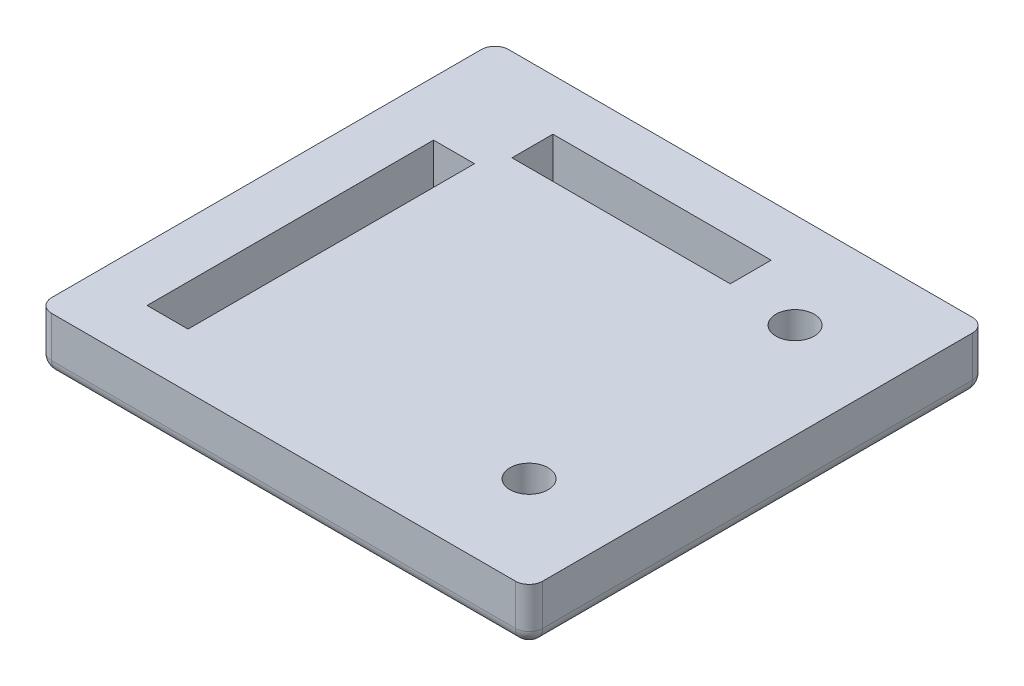
ISO-10303-21;
HEADER;
FILE_DESCRIPTION(('STEP AP214'),'2;1');
FILE_NAME('part.step','',(''),(''),'','','');
FILE_SCHEMA(('AUTOMOTIVE_DESIGN { 1 0 10303 214 1 1 1 1 }'));
ENDSEC;
DATA;
#1=APPLICATION_CONTEXT('core data for automotive mechanical design processes');
#2=APPLICATION_PROTOCOL_DEFINITION('international standard','automotive_design',2000,#1);
#3=PRODUCT_CONTEXT('',#1,'mechanical');
#4=PRODUCT('Part','Part','',(#3));
#5=PRODUCT_RELATED_PRODUCT_CATEGORY('part','',(#4));
#6=PRODUCT_DEFINITION_FORMATION('','',#4);
#7=PRODUCT_DEFINITION_CONTEXT('part definition',#1,'design');
#8=PRODUCT_DEFINITION('design','',#6,#7);
#9=PRODUCT_DEFINITION_SHAPE('','',#8);
#10=(LENGTH_UNIT() NAMED_UNIT(*) SI_UNIT(.MILLI.,.METRE.));
#11=(NAMED_UNIT(*) PLANE_ANGLE_UNIT() SI_UNIT($,.RADIAN.));
#12=(NAMED_UNIT(*) SI_UNIT($,.STERADIAN.) SOLID_ANGLE_UNIT());
#13=UNCERTAINTY_MEASURE_WITH_UNIT(LENGTH_MEASURE(1.E-05),#10,'distance_accuracy_value','');
#14=(GEOMETRIC_REPRESENTATION_CONTEXT(3) GLOBAL_UNCERTAINTY_ASSIGNED_CONTEXT((#13)) GLOBAL_UNIT_ASSIGNED_CONTEXT((#10,
#11,#12)) REPRESENTATION_CONTEXT('',''));
#15=CARTESIAN_POINT('',(0.,0.,0.));
#16=DIRECTION('',(0.,0.,1.));
#17=DIRECTION('',(1.,0.,0.));
#18=AXIS2_PLACEMENT_3D('',#15,#16,#17);
#19=CARTESIAN_POINT('',(0.,4.,0.));
#20=DIRECTION('',(0.,1.,0.));
#21=DIRECTION('',(0.,0.,1.));
#22=AXIS2_PLACEMENT_3D('',#19,#20,#21);
#23=PLANE('',#22);
#24=CARTESIAN_POINT('',(11.,4.,9.75));
#25=DIRECTION('',(0.,1.,0.));
#26=DIRECTION('',(0.,0.,1.));
#27=AXIS2_PLACEMENT_3D('',#24,#25,#26);
#28=CIRCLE('',#27,1.4);
#29=CARTESIAN_POINT('',(11.,4.,11.15));
#30=VERTEX_POINT('',#29);
#31=EDGE_CURVE('E274',#30,#30,#28,.T.);
#32=ORIENTED_EDGE('',*,*,#31,.F.);
#33=EDGE_LOOP('',(#32));
#34=FACE_BOUND('',#33,.T.);
#35=DIRECTION('',(1.,0.,0.));
#36=VECTOR('',#35,1.);
#37=CARTESIAN_POINT('',(-18.,4.,16.75));
#38=LINE('',#37,#36);
#39=CARTESIAN_POINT('',(-17.,4.,16.75));
#40=VERTEX_POINT('',#39);
#41=CARTESIAN_POINT('',(17.,4.,16.75));
#42=VERTEX_POINT('',#41);
#43=EDGE_CURVE('E293',#40,#42,#38,.T.);
#44=ORIENTED_EDGE('',*,*,#43,.T.);
#45=CARTESIAN_POINT('',(17.,4.,15.75));
#46=DIRECTION('',(0.,1.,0.));
#47=DIRECTION('',(0.,0.,1.));
#48=AXIS2_PLACEMENT_3D('',#45,#46,#47);
#49=CIRCLE('',#48,1.);
#50=CARTESIAN_POINT('',(18.,4.,15.75));
#51=VERTEX_POINT('',#50);
#52=EDGE_CURVE('E325',#42,#51,#49,.T.);
#53=ORIENTED_EDGE('',*,*,#52,.T.);
#54=DIRECTION('',(0.,0.,-1.));
#55=VECTOR('',#54,1.);
#56=CARTESIAN_POINT('',(18.,4.,-16.75));
#57=LINE('',#56,#55);
#58=CARTESIAN_POINT('',(18.,4.,-15.75));
#59=VERTEX_POINT('',#58);
#60=EDGE_CURVE('E278',#51,#59,#57,.T.);
#61=ORIENTED_EDGE('',*,*,#60,.T.);
#62=CARTESIAN_POINT('',(17.,4.,-15.75));
#63=DIRECTION('',(0.,1.,0.));
#64=DIRECTION('',(0.,0.,1.));
#65=AXIS2_PLACEMENT_3D('',#62,#63,#64);
#66=CIRCLE('',#65,1.);
#67=CARTESIAN_POINT('',(17.,4.,-16.75));
#68=VERTEX_POINT('',#67);
#69=EDGE_CURVE('E322',#59,#68,#66,.T.);
#70=ORIENTED_EDGE('',*,*,#69,.T.);
#71=DIRECTION('',(-1.,0.,0.));
#72=VECTOR('',#71,1.);
#73=CARTESIAN_POINT('',(-18.,4.,-16.75));
#74=LINE('',#73,#72);
#75=CARTESIAN_POINT('',(-17.,4.,-16.75));
#76=VERTEX_POINT('',#75);
#77=EDGE_CURVE('E285',#68,#76,#74,.T.);
#78=ORIENTED_EDGE('',*,*,#77,.T.);
#79=CARTESIAN_POINT('',(-17.,4.,-15.75));
#80=DIRECTION('',(0.,1.,0.));
#81=DIRECTION('',(0.,0.,1.));
#82=AXIS2_PLACEMENT_3D('',#79,#80,#81);
#83=CIRCLE('',#82,1.);
#84=CARTESIAN_POINT('',(-18.,4.,-15.75));
#85=VERTEX_POINT('',#84);
#86=EDGE_CURVE('E319',#76,#85,#83,.T.);
#87=ORIENTED_EDGE('',*,*,#86,.T.);
#88=DIRECTION('',(0.,0.,1.));
#89=VECTOR('',#88,1.);
#90=CARTESIAN_POINT('',(-18.,4.,-16.75));
#91=LINE('',#90,#89);
#92=CARTESIAN_POINT('',(-18.,4.,15.75));
#93=VERTEX_POINT('',#92);
#94=EDGE_CURVE('E289',#85,#93,#91,.T.);
#95=ORIENTED_EDGE('',*,*,#94,.T.);
#96=CARTESIAN_POINT('',(-17.,4.,15.75));
#97=DIRECTION('',(0.,1.,0.));
#98=DIRECTION('',(0.,0.,1.));
#99=AXIS2_PLACEMENT_3D('',#96,#97,#98);
#100=CIRCLE('',#99,1.);
#101=EDGE_CURVE('E316',#93,#40,#100,.T.);
#102=ORIENTED_EDGE('',*,*,#101,.T.);
#103=EDGE_LOOP('',(#44,#53,#61,#70,#78,#87,#95,#102));
#104=FACE_BOUND('',#103,.T.);
#105=CARTESIAN_POINT('',(11.,4.,-9.75));
#106=DIRECTION('',(0.,1.,0.));
#107=DIRECTION('',(0.,0.,1.));
#108=AXIS2_PLACEMENT_3D('',#105,#106,#107);
#109=CIRCLE('',#108,1.4);
#110=CARTESIAN_POINT('',(11.,4.,-8.35));
#111=VERTEX_POINT('',#110);
#112=EDGE_CURVE('E266',#111,#111,#109,.T.);
#113=ORIENTED_EDGE('',*,*,#112,.F.);
#114=EDGE_LOOP('',(#113));
#115=FACE_BOUND('',#114,.T.);
#116=DIRECTION('',(1.,0.,0.));
#117=VECTOR('',#116,1.);
#118=CARTESIAN_POINT('',(-14.,4.,12.75));
#119=LINE('',#118,#117);
#120=CARTESIAN_POINT('',(-14.,4.,12.75));
#121=VERTEX_POINT('',#120);
#122=CARTESIAN_POINT('',(-11.,4.,12.75));
#123=VERTEX_POINT('',#122);
#124=EDGE_CURVE('E226',#121,#123,#119,.T.);
#125=ORIENTED_EDGE('',*,*,#124,.F.);
#126=DIRECTION('',(0.,0.,1.));
#127=VECTOR('',#126,1.);
#128=CARTESIAN_POINT('',(-14.,4.,-8.25));
#129=LINE('',#128,#127);
#130=CARTESIAN_POINT('',(-14.,4.,-8.25));
#131=VERTEX_POINT('',#130);
#132=EDGE_CURVE('E223',#131,#121,#129,.T.);
#133=ORIENTED_EDGE('',*,*,#132,.F.);
#134=DIRECTION('',(-1.,0.,0.));
#135=VECTOR('',#134,1.);
#136=CARTESIAN_POINT('',(-14.,4.,-8.25));
#137=LINE('',#136,#135);
#138=CARTESIAN_POINT('',(-11.,4.,-8.25));
#139=VERTEX_POINT('',#138);
#140=EDGE_CURVE('E234',#139,#131,#137,.T.);
#141=ORIENTED_EDGE('',*,*,#140,.F.);
#142=DIRECTION('',(0.,0.,-1.));
#143=VECTOR('',#142,1.);
#144=CARTESIAN_POINT('',(-11.,4.,-8.25));
#145=LINE('',#144,#143);
#146=EDGE_CURVE('E230',#123,#139,#145,.T.);
#147=ORIENTED_EDGE('',*,*,#146,.F.);
#148=EDGE_LOOP('',(#125,#133,#141,#147));
#149=FACE_BOUND('',#148,.T.);
#150=DIRECTION('',(-1.,0.,0.));
#151=VECTOR('',#150,1.);
#152=CARTESIAN_POINT('',(6.,4.,-13.));
#153=LINE('',#152,#151);
#154=CARTESIAN_POINT('',(6.,4.,-13.));
#155=VERTEX_POINT('',#154);
#156=CARTESIAN_POINT('',(-10.,4.,-13.));
#157=VERTEX_POINT('',#156);
#158=EDGE_CURVE('E181',#155,#157,#153,.T.);
#159=ORIENTED_EDGE('',*,*,#158,.F.);
#160=DIRECTION('',(0.,0.,-1.));
#161=VECTOR('',#160,1.);
#162=CARTESIAN_POINT('',(6.,4.,-13.));
#163=LINE('',#162,#161);
#164=CARTESIAN_POINT('',(6.,4.,-10.));
#165=VERTEX_POINT('',#164);
#166=EDGE_CURVE('E170',#165,#155,#163,.T.);
#167=ORIENTED_EDGE('',*,*,#166,.F.);
#168=DIRECTION('',(1.,0.,0.));
#169=VECTOR('',#168,1.);
#170=CARTESIAN_POINT('',(6.,4.,-10.));
#171=LINE('',#170,#169);
#172=CARTESIAN_POINT('',(-10.,4.,-10.));
#173=VERTEX_POINT('',#172);
#174=EDGE_CURVE('E199',#173,#165,#171,.T.);
#175=ORIENTED_EDGE('',*,*,#174,.F.);
#176=DIRECTION('',(0.,0.,1.));
#177=VECTOR('',#176,1.);
#178=CARTESIAN_POINT('',(-10.,4.,-13.));
#179=LINE('',#178,#177);
#180=EDGE_CURVE('E195',#157,#173,#179,.T.);
#181=ORIENTED_EDGE('',*,*,#180,.F.);
#182=EDGE_LOOP('',(#159,#167,#175,#181));
#183=FACE_BOUND('',#182,.T.);
#184=ADVANCED_FACE('F43',(#34,#104,#115,#149,#183),#23,.T.);
#185=CARTESIAN_POINT('',(0.,0.,0.));
#186=DIRECTION('',(0.,1.,0.));
#187=DIRECTION('',(0.,0.,1.));
#188=AXIS2_PLACEMENT_3D('',#185,#186,#187);
#189=PLANE('',#188);
#190=DIRECTION('',(0.,0.,-1.));
#191=VECTOR('',#190,1.);
#192=CARTESIAN_POINT('',(17.,0.,0.));
#193=LINE('',#192,#191);
#194=CARTESIAN_POINT('',(17.,0.,-15.75));
#195=VERTEX_POINT('',#194);
#196=CARTESIAN_POINT('',(17.,0.,15.75));
#197=VERTEX_POINT('',#196);
#198=EDGE_CURVE('E53',#195,#197,#193,.F.);
#199=ORIENTED_EDGE('',*,*,#198,.T.);
#200=DIRECTION('',(1.,0.,0.));
#201=VECTOR('',#200,1.);
#202=CARTESIAN_POINT('',(0.,0.,15.75));
#203=LINE('',#202,#201);
#204=CARTESIAN_POINT('',(-17.,0.,15.75));
#205=VERTEX_POINT('',#204);
#206=EDGE_CURVE('E11',#197,#205,#203,.F.);
#207=ORIENTED_EDGE('',*,*,#206,.T.);
#208=DIRECTION('',(0.,0.,1.));
#209=VECTOR('',#208,1.);
#210=CARTESIAN_POINT('',(-17.,0.,0.));
#211=LINE('',#210,#209);
#212=CARTESIAN_POINT('',(-17.,0.,-15.75));
#213=VERTEX_POINT('',#212);
#214=EDGE_CURVE('E346',#205,#213,#211,.F.);
#215=ORIENTED_EDGE('',*,*,#214,.T.);
#216=DIRECTION('',(-1.,0.,0.));
#217=VECTOR('',#216,1.);
#218=CARTESIAN_POINT('',(0.,0.,-15.75));
#219=LINE('',#218,#217);
#220=EDGE_CURVE('E64',#213,#195,#219,.F.);
#221=ORIENTED_EDGE('',*,*,#220,.T.);
#222=EDGE_LOOP('',(#199,#207,#215,#221));
#223=FACE_BOUND('',#222,.T.);
#224=DIRECTION('',(0.,0.,1.));
#225=VECTOR('',#224,1.);
#226=CARTESIAN_POINT('',(-14.,0.,-8.25));
#227=LINE('',#226,#225);
#228=CARTESIAN_POINT('',(-14.,0.,-8.25));
#229=VERTEX_POINT('',#228);
#230=CARTESIAN_POINT('',(-14.,0.,12.75));
#231=VERTEX_POINT('',#230);
#232=EDGE_CURVE('E190',#229,#231,#227,.T.);
#233=ORIENTED_EDGE('',*,*,#232,.T.);
#234=DIRECTION('',(1.,0.,0.));
#235=VECTOR('',#234,1.);
#236=CARTESIAN_POINT('',(-14.,0.,12.75));
#237=LINE('',#236,#235);
#238=CARTESIAN_POINT('',(-11.,0.,12.75));
#239=VERTEX_POINT('',#238);
#240=EDGE_CURVE('E241',#231,#239,#237,.T.);
#241=ORIENTED_EDGE('',*,*,#240,.T.);
#242=DIRECTION('',(0.,0.,-1.));
#243=VECTOR('',#242,1.);
#244=CARTESIAN_POINT('',(-11.,0.,-8.25));
#245=LINE('',#244,#243);
#246=CARTESIAN_POINT('',(-11.,0.,-8.25));
#247=VERTEX_POINT('',#246);
#248=EDGE_CURVE('E245',#239,#247,#245,.T.);
#249=ORIENTED_EDGE('',*,*,#248,.T.);
#250=DIRECTION('',(-1.,0.,0.));
#251=VECTOR('',#250,1.);
#252=CARTESIAN_POINT('',(-14.,0.,-8.25));
#253=LINE('',#252,#251);
#254=EDGE_CURVE('E227',#247,#229,#253,.T.);
#255=ORIENTED_EDGE('',*,*,#254,.T.);
#256=EDGE_LOOP('',(#233,#241,#249,#255));
#257=FACE_BOUND('',#256,.T.);
#258=CARTESIAN_POINT('',(11.,0.,9.75));
#259=DIRECTION('',(0.,1.,0.));
#260=DIRECTION('',(0.,0.,1.));
#261=AXIS2_PLACEMENT_3D('',#258,#259,#260);
#262=CIRCLE('',#261,1.4);
#263=CARTESIAN_POINT('',(11.,0.,11.15));
#264=VERTEX_POINT('',#263);
#265=EDGE_CURVE('E270',#264,#264,#262,.T.);
#266=ORIENTED_EDGE('',*,*,#265,.T.);
#267=EDGE_LOOP('',(#266));
#268=FACE_BOUND('',#267,.T.);
#269=CARTESIAN_POINT('',(11.,0.,-9.75));
#270=DIRECTION('',(0.,1.,0.));
#271=DIRECTION('',(0.,0.,1.));
#272=AXIS2_PLACEMENT_3D('',#269,#270,#271);
#273=CIRCLE('',#272,1.4);
#274=CARTESIAN_POINT('',(11.,0.,-8.35));
#275=VERTEX_POINT('',#274);
#276=EDGE_CURVE('E265',#275,#275,#273,.T.);
#277=ORIENTED_EDGE('',*,*,#276,.T.);
#278=EDGE_LOOP('',(#277));
#279=FACE_BOUND('',#278,.T.);
#280=DIRECTION('',(0.,0.,-1.));
#281=VECTOR('',#280,1.);
#282=CARTESIAN_POINT('',(6.,0.,-13.));
#283=LINE('',#282,#281);
#284=CARTESIAN_POINT('',(6.,0.,-10.));
#285=VERTEX_POINT('',#284);
#286=CARTESIAN_POINT('',(6.,0.,-13.));
#287=VERTEX_POINT('',#286);
#288=EDGE_CURVE('E204',#285,#287,#283,.T.);
#289=ORIENTED_EDGE('',*,*,#288,.T.);
#290=DIRECTION('',(-1.,0.,0.));
#291=VECTOR('',#290,1.);
#292=CARTESIAN_POINT('',(6.,0.,-13.));
#293=LINE('',#292,#291);
#294=CARTESIAN_POINT('',(-10.,0.,-13.));
#295=VERTEX_POINT('',#294);
#296=EDGE_CURVE('E188',#287,#295,#293,.T.);
#297=ORIENTED_EDGE('',*,*,#296,.T.);
#298=DIRECTION('',(0.,0.,1.));
#299=VECTOR('',#298,1.);
#300=CARTESIAN_POINT('',(-10.,0.,-13.));
#301=LINE('',#300,#299);
#302=CARTESIAN_POINT('',(-10.,0.,-10.));
#303=VERTEX_POINT('',#302);
#304=EDGE_CURVE('E209',#295,#303,#301,.T.);
#305=ORIENTED_EDGE('',*,*,#304,.T.);
#306=DIRECTION('',(1.,0.,0.));
#307=VECTOR('',#306,1.);
#308=CARTESIAN_POINT('',(6.,0.,-10.));
#309=LINE('',#308,#307);
#310=EDGE_CURVE('E182',#303,#285,#309,.T.);
#311=ORIENTED_EDGE('',*,*,#310,.T.);
#312=EDGE_LOOP('',(#289,#297,#305,#311));
#313=FACE_BOUND('',#312,.T.);
#314=ADVANCED_FACE('F456',(#223,#257,#268,#279,#313),#189,.F.);
#315=CARTESIAN_POINT('',(18.,4.,-16.75));
#316=DIRECTION('',(-1.,0.,0.));
#317=DIRECTION('',(0.,0.,1.));
#318=AXIS2_PLACEMENT_3D('',#315,#316,#317);
#319=PLANE('',#318);
#320=ORIENTED_EDGE('',*,*,#60,.F.);
#321=DIRECTION('',(0.,-1.,0.));
#322=VECTOR('',#321,1.);
#323=CARTESIAN_POINT('',(18.,4.,15.75));
#324=LINE('',#323,#322);
#325=CARTESIAN_POINT('',(18.,1.,15.75));
#326=VERTEX_POINT('',#325);
#327=EDGE_CURVE('E303',#51,#326,#324,.T.);
#328=ORIENTED_EDGE('',*,*,#327,.T.);
#329=DIRECTION('',(0.,0.,-1.));
#330=VECTOR('',#329,1.);
#331=CARTESIAN_POINT('',(18.,1.,-16.75));
#332=LINE('',#331,#330);
#333=CARTESIAN_POINT('',(18.,1.,-15.75));
#334=VERTEX_POINT('',#333);
#335=EDGE_CURVE('E297',#326,#334,#332,.T.);
#336=ORIENTED_EDGE('',*,*,#335,.T.);
#337=DIRECTION('',(0.,-1.,0.));
#338=VECTOR('',#337,1.);
#339=CARTESIAN_POINT('',(18.,4.,-15.75));
#340=LINE('',#339,#338);
#341=EDGE_CURVE('E300',#334,#59,#340,.F.);
#342=ORIENTED_EDGE('',*,*,#341,.T.);
#343=EDGE_LOOP('',(#320,#328,#336,#342));
#344=FACE_BOUND('',#343,.T.);
#345=ADVANCED_FACE('F459',(#344),#319,.F.);
#346=CARTESIAN_POINT('',(-18.,4.,-16.75));
#347=DIRECTION('',(0.,0.,1.));
#348=DIRECTION('',(1.,0.,0.));
#349=AXIS2_PLACEMENT_3D('',#346,#347,#348);
#350=PLANE('',#349);
#351=ORIENTED_EDGE('',*,*,#77,.F.);
#352=DIRECTION('',(0.,-1.,0.));
#353=VECTOR('',#352,1.);
#354=CARTESIAN_POINT('',(17.,4.,-16.75));
#355=LINE('',#354,#353);
#356=CARTESIAN_POINT('',(17.,1.,-16.75));
#357=VERTEX_POINT('',#356);
#358=EDGE_CURVE('E334',#68,#357,#355,.T.);
#359=ORIENTED_EDGE('',*,*,#358,.T.);
#360=DIRECTION('',(-1.,0.,0.));
#361=VECTOR('',#360,1.);
#362=CARTESIAN_POINT('',(-18.,1.,-16.75));
#363=LINE('',#362,#361);
#364=CARTESIAN_POINT('',(-17.,1.,-16.75));
#365=VERTEX_POINT('',#364);
#366=EDGE_CURVE('E328',#357,#365,#363,.T.);
#367=ORIENTED_EDGE('',*,*,#366,.T.);
#368=DIRECTION('',(0.,-1.,0.));
#369=VECTOR('',#368,1.);
#370=CARTESIAN_POINT('',(-17.,4.,-16.75));
#371=LINE('',#370,#369);
#372=EDGE_CURVE('E331',#365,#76,#371,.F.);
#373=ORIENTED_EDGE('',*,*,#372,.T.);
#374=EDGE_LOOP('',(#351,#359,#367,#373));
#375=FACE_BOUND('',#374,.T.);
#376=ADVANCED_FACE('F409',(#375),#350,.F.);
#377=CARTESIAN_POINT('',(-18.,4.,-16.75));
#378=DIRECTION('',(1.,0.,0.));
#379=DIRECTION('',(0.,0.,-1.));
#380=AXIS2_PLACEMENT_3D('',#377,#378,#379);
#381=PLANE('',#380);
#382=ORIENTED_EDGE('',*,*,#94,.F.);
#383=DIRECTION('',(0.,-1.,0.));
#384=VECTOR('',#383,1.);
#385=CARTESIAN_POINT('',(-18.,4.,-15.75));
#386=LINE('',#385,#384);
#387=CARTESIAN_POINT('',(-18.,1.,-15.75));
#388=VERTEX_POINT('',#387);
#389=EDGE_CURVE('E343',#85,#388,#386,.T.);
#390=ORIENTED_EDGE('',*,*,#389,.T.);
#391=DIRECTION('',(0.,0.,1.));
#392=VECTOR('',#391,1.);
#393=CARTESIAN_POINT('',(-18.,1.,-16.75));
#394=LINE('',#393,#392);
#395=CARTESIAN_POINT('',(-18.,1.,15.75));
#396=VERTEX_POINT('',#395);
#397=EDGE_CURVE('E340',#388,#396,#394,.T.);
#398=ORIENTED_EDGE('',*,*,#397,.T.);
#399=DIRECTION('',(0.,-1.,0.));
#400=VECTOR('',#399,1.);
#401=CARTESIAN_POINT('',(-18.,4.,15.75));
#402=LINE('',#401,#400);
#403=EDGE_CURVE('E337',#396,#93,#402,.F.);
#404=ORIENTED_EDGE('',*,*,#403,.T.);
#405=EDGE_LOOP('',(#382,#390,#398,#404));
#406=FACE_BOUND('',#405,.T.);
#407=ADVANCED_FACE('F492',(#406),#381,.F.);
#408=CARTESIAN_POINT('',(-18.,4.,16.75));
#409=DIRECTION('',(0.,0.,-1.));
#410=DIRECTION('',(-1.,0.,0.));
#411=AXIS2_PLACEMENT_3D('',#408,#409,#410);
#412=PLANE('',#411);
#413=DIRECTION('',(1.,0.,0.));
#414=VECTOR('',#413,1.);
#415=CARTESIAN_POINT('',(-18.,1.,16.75));
#416=LINE('',#415,#414);
#417=CARTESIAN_POINT('',(-17.,1.,16.75));
#418=VERTEX_POINT('',#417);
#419=CARTESIAN_POINT('',(17.,1.,16.75));
#420=VERTEX_POINT('',#419);
#421=EDGE_CURVE('E310',#418,#420,#416,.T.);
#422=ORIENTED_EDGE('',*,*,#421,.T.);
#423=DIRECTION('',(0.,-1.,0.));
#424=VECTOR('',#423,1.);
#425=CARTESIAN_POINT('',(17.,4.,16.75));
#426=LINE('',#425,#424);
#427=EDGE_CURVE('E313',#420,#42,#426,.F.);
#428=ORIENTED_EDGE('',*,*,#427,.T.);
#429=ORIENTED_EDGE('',*,*,#43,.F.);
#430=DIRECTION('',(0.,-1.,0.));
#431=VECTOR('',#430,1.);
#432=CARTESIAN_POINT('',(-17.,4.,16.75));
#433=LINE('',#432,#431);
#434=EDGE_CURVE('E307',#40,#418,#433,.T.);
#435=ORIENTED_EDGE('',*,*,#434,.T.);
#436=EDGE_LOOP('',(#422,#428,#429,#435));
#437=FACE_BOUND('',#436,.T.);
#438=ADVANCED_FACE('F442',(#437),#412,.F.);
#439=CARTESIAN_POINT('',(11.,4.,9.75));
#440=DIRECTION('',(0.,-1.,0.));
#441=DIRECTION('',(0.,0.,-1.));
#442=AXIS2_PLACEMENT_3D('',#439,#440,#441);
#443=CYLINDRICAL_SURFACE('',#442,1.4);
#444=ORIENTED_EDGE('',*,*,#31,.T.);
#445=EDGE_LOOP('',(#444));
#446=FACE_BOUND('',#445,.T.);
#447=ORIENTED_EDGE('',*,*,#265,.F.);
#448=EDGE_LOOP('',(#447));
#449=FACE_BOUND('',#448,.T.);
#450=ADVANCED_FACE('F487',(#446,#449),#443,.F.);
#451=CARTESIAN_POINT('',(11.,4.,-9.75));
#452=DIRECTION('',(0.,-1.,0.));
#453=DIRECTION('',(0.,0.,-1.));
#454=AXIS2_PLACEMENT_3D('',#451,#452,#453);
#455=CYLINDRICAL_SURFACE('',#454,1.4);
#456=ORIENTED_EDGE('',*,*,#112,.T.);
#457=EDGE_LOOP('',(#456));
#458=FACE_BOUND('',#457,.T.);
#459=ORIENTED_EDGE('',*,*,#276,.F.);
#460=EDGE_LOOP('',(#459));
#461=FACE_BOUND('',#460,.T.);
#462=ADVANCED_FACE('F583',(#458,#461),#455,.F.);
#463=CARTESIAN_POINT('',(-14.,4.,-8.25));
#464=DIRECTION('',(1.,0.,0.));
#465=DIRECTION('',(0.,0.,-1.));
#466=AXIS2_PLACEMENT_3D('',#463,#464,#465);
#467=PLANE('',#466);
#468=ORIENTED_EDGE('',*,*,#232,.F.);
#469=DIRECTION('',(0.,-1.,0.));
#470=VECTOR('',#469,1.);
#471=CARTESIAN_POINT('',(-14.,4.,-8.25));
#472=LINE('',#471,#470);
#473=EDGE_CURVE('E237',#131,#229,#472,.T.);
#474=ORIENTED_EDGE('',*,*,#473,.F.);
#475=ORIENTED_EDGE('',*,*,#132,.T.);
#476=DIRECTION('',(0.,-1.,0.));
#477=VECTOR('',#476,1.);
#478=CARTESIAN_POINT('',(-14.,4.,12.75));
#479=LINE('',#478,#477);
#480=EDGE_CURVE('E261',#121,#231,#479,.T.);
#481=ORIENTED_EDGE('',*,*,#480,.T.);
#482=EDGE_LOOP('',(#468,#474,#475,#481));
#483=FACE_BOUND('',#482,.T.);
#484=ADVANCED_FACE('F589',(#483),#467,.T.);
#485=CARTESIAN_POINT('',(-14.,4.,12.75));
#486=DIRECTION('',(0.,0.,-1.));
#487=DIRECTION('',(-1.,0.,0.));
#488=AXIS2_PLACEMENT_3D('',#485,#486,#487);
#489=PLANE('',#488);
#490=ORIENTED_EDGE('',*,*,#240,.F.);
#491=ORIENTED_EDGE('',*,*,#480,.F.);
#492=ORIENTED_EDGE('',*,*,#124,.T.);
#493=DIRECTION('',(0.,-1.,0.));
#494=VECTOR('',#493,1.);
#495=CARTESIAN_POINT('',(-11.,4.,12.75));
#496=LINE('',#495,#494);
#497=EDGE_CURVE('E258',#123,#239,#496,.T.);
#498=ORIENTED_EDGE('',*,*,#497,.T.);
#499=EDGE_LOOP('',(#490,#491,#492,#498));
#500=FACE_BOUND('',#499,.T.);
#501=ADVANCED_FACE('F596',(#500),#489,.T.);
#502=CARTESIAN_POINT('',(-11.,4.,-8.25));
#503=DIRECTION('',(-1.,0.,0.));
#504=DIRECTION('',(0.,0.,1.));
#505=AXIS2_PLACEMENT_3D('',#502,#503,#504);
#506=PLANE('',#505);
#507=ORIENTED_EDGE('',*,*,#248,.F.);
#508=ORIENTED_EDGE('',*,*,#497,.F.);
#509=ORIENTED_EDGE('',*,*,#146,.T.);
#510=DIRECTION('',(0.,-1.,0.));
#511=VECTOR('',#510,1.);
#512=CARTESIAN_POINT('',(-11.,4.,-8.25));
#513=LINE('',#512,#511);
#514=EDGE_CURVE('E255',#139,#247,#513,.T.);
#515=ORIENTED_EDGE('',*,*,#514,.T.);
#516=EDGE_LOOP('',(#507,#508,#509,#515));
#517=FACE_BOUND('',#516,.T.);
#518=ADVANCED_FACE('F604',(#517),#506,.T.);
#519=CARTESIAN_POINT('',(-14.,4.,-8.25));
#520=DIRECTION('',(0.,0.,1.));
#521=DIRECTION('',(1.,0.,0.));
#522=AXIS2_PLACEMENT_3D('',#519,#520,#521);
#523=PLANE('',#522);
#524=ORIENTED_EDGE('',*,*,#254,.F.);
#525=ORIENTED_EDGE('',*,*,#514,.F.);
#526=ORIENTED_EDGE('',*,*,#140,.T.);
#527=ORIENTED_EDGE('',*,*,#473,.T.);
#528=EDGE_LOOP('',(#524,#525,#526,#527));
#529=FACE_BOUND('',#528,.T.);
#530=ADVANCED_FACE('F612',(#529),#523,.T.);
#531=CARTESIAN_POINT('',(6.,4.,-13.));
#532=DIRECTION('',(-1.,0.,0.));
#533=DIRECTION('',(0.,0.,1.));
#534=AXIS2_PLACEMENT_3D('',#531,#532,#533);
#535=PLANE('',#534);
#536=ORIENTED_EDGE('',*,*,#288,.F.);
#537=DIRECTION('',(0.,-1.,0.));
#538=VECTOR('',#537,1.);
#539=CARTESIAN_POINT('',(6.,4.,-10.));
#540=LINE('',#539,#538);
#541=EDGE_CURVE('E176',#165,#285,#540,.T.);
#542=ORIENTED_EDGE('',*,*,#541,.F.);
#543=ORIENTED_EDGE('',*,*,#166,.T.);
#544=DIRECTION('',(0.,-1.,0.));
#545=VECTOR('',#544,1.);
#546=CARTESIAN_POINT('',(6.,4.,-13.));
#547=LINE('',#546,#545);
#548=EDGE_CURVE('E173',#155,#287,#547,.T.);
#549=ORIENTED_EDGE('',*,*,#548,.T.);
#550=EDGE_LOOP('',(#536,#542,#543,#549));
#551=FACE_BOUND('',#550,.T.);
#552=ADVANCED_FACE('F172',(#551),#535,.T.);
#553=CARTESIAN_POINT('',(6.,4.,-13.));
#554=DIRECTION('',(0.,0.,1.));
#555=DIRECTION('',(1.,0.,0.));
#556=AXIS2_PLACEMENT_3D('',#553,#554,#555);
#557=PLANE('',#556);
#558=ORIENTED_EDGE('',*,*,#296,.F.);
#559=ORIENTED_EDGE('',*,*,#548,.F.);
#560=ORIENTED_EDGE('',*,*,#158,.T.);
#561=DIRECTION('',(0.,-1.,0.));
#562=VECTOR('',#561,1.);
#563=CARTESIAN_POINT('',(-10.,4.,-13.));
#564=LINE('',#563,#562);
#565=EDGE_CURVE('E191',#157,#295,#564,.T.);
#566=ORIENTED_EDGE('',*,*,#565,.T.);
#567=EDGE_LOOP('',(#558,#559,#560,#566));
#568=FACE_BOUND('',#567,.T.);
#569=ADVANCED_FACE('F185',(#568),#557,.T.);
#570=CARTESIAN_POINT('',(-10.,4.,-13.));
#571=DIRECTION('',(1.,0.,0.));
#572=DIRECTION('',(0.,0.,-1.));
#573=AXIS2_PLACEMENT_3D('',#570,#571,#572);
#574=PLANE('',#573);
#575=ORIENTED_EDGE('',*,*,#304,.F.);
#576=ORIENTED_EDGE('',*,*,#565,.F.);
#577=ORIENTED_EDGE('',*,*,#180,.T.);
#578=DIRECTION('',(0.,-1.,0.));
#579=VECTOR('',#578,1.);
#580=CARTESIAN_POINT('',(-10.,4.,-10.));
#581=LINE('',#580,#579);
#582=EDGE_CURVE('E218',#173,#303,#581,.T.);
#583=ORIENTED_EDGE('',*,*,#582,.T.);
#584=EDGE_LOOP('',(#575,#576,#577,#583));
#585=FACE_BOUND('',#584,.T.);
#586=ADVANCED_FACE('F471',(#585),#574,.T.);
#587=CARTESIAN_POINT('',(6.,4.,-10.));
#588=DIRECTION('',(0.,0.,-1.));
#589=DIRECTION('',(-1.,0.,0.));
#590=AXIS2_PLACEMENT_3D('',#587,#588,#589);
#591=PLANE('',#590);
#592=ORIENTED_EDGE('',*,*,#310,.F.);
#593=ORIENTED_EDGE('',*,*,#582,.F.);
#594=ORIENTED_EDGE('',*,*,#174,.T.);
#595=ORIENTED_EDGE('',*,*,#541,.T.);
#596=EDGE_LOOP('',(#592,#593,#594,#595));
#597=FACE_BOUND('',#596,.T.);
#598=ADVANCED_FACE('F468',(#597),#591,.T.);
#599=CARTESIAN_POINT('',(-17.,4.,-15.75));
#600=DIRECTION('',(0.,-1.,0.));
#601=DIRECTION('',(0.,0.,-1.));
#602=AXIS2_PLACEMENT_3D('',#599,#600,#601);
#603=CYLINDRICAL_SURFACE('',#602,1.);
#604=CARTESIAN_POINT('',(-17.,1.,-15.75));
#605=DIRECTION('',(0.,-1.,0.));
#606=DIRECTION('',(0.,0.,-1.));
#607=AXIS2_PLACEMENT_3D('',#604,#605,#606);
#608=CIRCLE('',#607,1.);
#609=EDGE_CURVE('E47',#388,#365,#608,.T.);
#610=ORIENTED_EDGE('',*,*,#609,.F.);
#611=ORIENTED_EDGE('',*,*,#389,.F.);
#612=ORIENTED_EDGE('',*,*,#86,.F.);
#613=ORIENTED_EDGE('',*,*,#372,.F.);
#614=EDGE_LOOP('',(#610,#611,#612,#613));
#615=FACE_BOUND('',#614,.T.);
#616=ADVANCED_FACE('F45',(#615),#603,.T.);
#617=CARTESIAN_POINT('',(-17.,1.,-15.75));
#618=DIRECTION('',(0.,0.,-1.));
#619=DIRECTION('',(-1.,0.,0.));
#620=AXIS2_PLACEMENT_3D('',#617,#618,#619);
#621=SPHERICAL_SURFACE('',#620,1.);
#622=CARTESIAN_POINT('',(-17.,1.,-15.75));
#623=DIRECTION('',(0.,0.,-1.));
#624=DIRECTION('',(-1.,0.,0.));
#625=AXIS2_PLACEMENT_3D('',#622,#623,#624);
#626=CIRCLE('',#625,1.);
#627=EDGE_CURVE('E387',#388,#213,#626,.F.);
#628=ORIENTED_EDGE('',*,*,#627,.F.);
#629=ORIENTED_EDGE('',*,*,#609,.T.);
#630=CARTESIAN_POINT('',(-17.,1.,-15.75));
#631=DIRECTION('',(-1.,0.,0.));
#632=DIRECTION('',(0.,0.,1.));
#633=AXIS2_PLACEMENT_3D('',#630,#631,#632);
#634=CIRCLE('',#633,1.);
#635=EDGE_CURVE('E390',#213,#365,#634,.F.);
#636=ORIENTED_EDGE('',*,*,#635,.F.);
#637=EDGE_LOOP('',(#628,#629,#636));
#638=FACE_BOUND('',#637,.T.);
#639=ADVANCED_FACE('F401',(#638),#621,.T.);
#640=CARTESIAN_POINT('',(17.,4.,-15.75));
#641=DIRECTION('',(0.,-1.,0.));
#642=DIRECTION('',(0.,0.,-1.));
#643=AXIS2_PLACEMENT_3D('',#640,#641,#642);
#644=CYLINDRICAL_SURFACE('',#643,1.);
#645=ORIENTED_EDGE('',*,*,#69,.F.);
#646=ORIENTED_EDGE('',*,*,#341,.F.);
#647=CARTESIAN_POINT('',(17.,1.,-15.75));
#648=DIRECTION('',(0.,-1.,0.));
#649=DIRECTION('',(0.,0.,-1.));
#650=AXIS2_PLACEMENT_3D('',#647,#648,#649);
#651=CIRCLE('',#650,1.);
#652=EDGE_CURVE('E383',#357,#334,#651,.T.);
#653=ORIENTED_EDGE('',*,*,#652,.F.);
#654=ORIENTED_EDGE('',*,*,#358,.F.);
#655=EDGE_LOOP('',(#645,#646,#653,#654));
#656=FACE_BOUND('',#655,.T.);
#657=ADVANCED_FACE('F418',(#656),#644,.T.);
#658=CARTESIAN_POINT('',(-18.,1.,-15.75));
#659=DIRECTION('',(-1.,0.,0.));
#660=DIRECTION('',(0.,0.,1.));
#661=AXIS2_PLACEMENT_3D('',#658,#659,#660);
#662=CYLINDRICAL_SURFACE('',#661,1.);
#663=ORIENTED_EDGE('',*,*,#635,.T.);
#664=ORIENTED_EDGE('',*,*,#366,.F.);
#665=CARTESIAN_POINT('',(17.,1.,-15.75));
#666=DIRECTION('',(1.,0.,0.));
#667=DIRECTION('',(0.,0.,-1.));
#668=AXIS2_PLACEMENT_3D('',#665,#666,#667);
#669=CIRCLE('',#668,1.);
#670=EDGE_CURVE('E379',#195,#357,#669,.T.);
#671=ORIENTED_EDGE('',*,*,#670,.F.);
#672=ORIENTED_EDGE('',*,*,#220,.F.);
#673=EDGE_LOOP('',(#663,#664,#671,#672));
#674=FACE_BOUND('',#673,.T.);
#675=ADVANCED_FACE('F420',(#674),#662,.T.);
#676=CARTESIAN_POINT('',(-17.,1.,-16.75));
#677=DIRECTION('',(0.,0.,1.));
#678=DIRECTION('',(1.,0.,0.));
#679=AXIS2_PLACEMENT_3D('',#676,#677,#678);
#680=CYLINDRICAL_SURFACE('',#679,1.);
#681=ORIENTED_EDGE('',*,*,#627,.T.);
#682=ORIENTED_EDGE('',*,*,#214,.F.);
#683=CARTESIAN_POINT('',(-17.,1.,15.75));
#684=DIRECTION('',(0.,0.,1.));
#685=DIRECTION('',(1.,0.,0.));
#686=AXIS2_PLACEMENT_3D('',#683,#684,#685);
#687=CIRCLE('',#686,1.);
#688=EDGE_CURVE('E375',#396,#205,#687,.T.);
#689=ORIENTED_EDGE('',*,*,#688,.F.);
#690=ORIENTED_EDGE('',*,*,#397,.F.);
#691=EDGE_LOOP('',(#681,#682,#689,#690));
#692=FACE_BOUND('',#691,.T.);
#693=ADVANCED_FACE('F455',(#692),#680,.T.);
#694=CARTESIAN_POINT('',(-17.,4.,15.75));
#695=DIRECTION('',(0.,-1.,0.));
#696=DIRECTION('',(0.,0.,-1.));
#697=AXIS2_PLACEMENT_3D('',#694,#695,#696);
#698=CYLINDRICAL_SURFACE('',#697,1.);
#699=ORIENTED_EDGE('',*,*,#101,.F.);
#700=ORIENTED_EDGE('',*,*,#403,.F.);
#701=CARTESIAN_POINT('',(-17.,1.,15.75));
#702=DIRECTION('',(0.,-1.,0.));
#703=DIRECTION('',(0.,0.,-1.));
#704=AXIS2_PLACEMENT_3D('',#701,#702,#703);
#705=CIRCLE('',#704,1.);
#706=EDGE_CURVE('E371',#418,#396,#705,.T.);
#707=ORIENTED_EDGE('',*,*,#706,.F.);
#708=ORIENTED_EDGE('',*,*,#434,.F.);
#709=EDGE_LOOP('',(#699,#700,#707,#708));
#710=FACE_BOUND('',#709,.T.);
#711=ADVANCED_FACE('F447',(#710),#698,.T.);
#712=CARTESIAN_POINT('',(17.,1.,-15.75));
#713=DIRECTION('',(0.,0.,-1.));
#714=DIRECTION('',(-1.,0.,0.));
#715=AXIS2_PLACEMENT_3D('',#712,#713,#714);
#716=SPHERICAL_SURFACE('',#715,1.);
#717=ORIENTED_EDGE('',*,*,#670,.T.);
#718=ORIENTED_EDGE('',*,*,#652,.T.);
#719=CARTESIAN_POINT('',(17.,1.,-15.75));
#720=DIRECTION('',(0.,0.,-1.));
#721=DIRECTION('',(-1.,0.,0.));
#722=AXIS2_PLACEMENT_3D('',#719,#720,#721);
#723=CIRCLE('',#722,1.);
#724=EDGE_CURVE('E367',#195,#334,#723,.F.);
#725=ORIENTED_EDGE('',*,*,#724,.F.);
#726=EDGE_LOOP('',(#717,#718,#725));
#727=FACE_BOUND('',#726,.T.);
#728=ADVANCED_FACE('F423',(#727),#716,.T.);
#729=CARTESIAN_POINT('',(-17.,1.,15.75));
#730=DIRECTION('',(-1.,0.,0.));
#731=DIRECTION('',(0.,0.,1.));
#732=AXIS2_PLACEMENT_3D('',#729,#730,#731);
#733=SPHERICAL_SURFACE('',#732,1.);
#734=ORIENTED_EDGE('',*,*,#706,.T.);
#735=ORIENTED_EDGE('',*,*,#688,.T.);
#736=CARTESIAN_POINT('',(-17.,1.,15.75));
#737=DIRECTION('',(-1.,0.,0.));
#738=DIRECTION('',(0.,0.,1.));
#739=AXIS2_PLACEMENT_3D('',#736,#737,#738);
#740=CIRCLE('',#739,1.);
#741=EDGE_CURVE('E364',#418,#205,#740,.F.);
#742=ORIENTED_EDGE('',*,*,#741,.F.);
#743=EDGE_LOOP('',(#734,#735,#742));
#744=FACE_BOUND('',#743,.T.);
#745=ADVANCED_FACE('F452',(#744),#733,.T.);
#746=CARTESIAN_POINT('',(17.,1.,-16.75));
#747=DIRECTION('',(0.,0.,-1.));
#748=DIRECTION('',(-1.,0.,0.));
#749=AXIS2_PLACEMENT_3D('',#746,#747,#748);
#750=CYLINDRICAL_SURFACE('',#749,1.);
#751=ORIENTED_EDGE('',*,*,#724,.T.);
#752=ORIENTED_EDGE('',*,*,#335,.F.);
#753=CARTESIAN_POINT('',(17.,1.,15.75));
#754=DIRECTION('',(0.,0.,1.));
#755=DIRECTION('',(1.,0.,0.));
#756=AXIS2_PLACEMENT_3D('',#753,#754,#755);
#757=CIRCLE('',#756,1.);
#758=EDGE_CURVE('E360',#197,#326,#757,.T.);
#759=ORIENTED_EDGE('',*,*,#758,.F.);
#760=ORIENTED_EDGE('',*,*,#198,.F.);
#761=EDGE_LOOP('',(#751,#752,#759,#760));
#762=FACE_BOUND('',#761,.T.);
#763=ADVANCED_FACE('F427',(#762),#750,.T.);
#764=CARTESIAN_POINT('',(-18.,1.,15.75));
#765=DIRECTION('',(1.,0.,0.));
#766=DIRECTION('',(0.,0.,-1.));
#767=AXIS2_PLACEMENT_3D('',#764,#765,#766);
#768=CYLINDRICAL_SURFACE('',#767,1.);
#769=ORIENTED_EDGE('',*,*,#741,.T.);
#770=ORIENTED_EDGE('',*,*,#206,.F.);
#771=CARTESIAN_POINT('',(17.,1.,15.75));
#772=DIRECTION('',(1.,0.,0.));
#773=DIRECTION('',(0.,0.,-1.));
#774=AXIS2_PLACEMENT_3D('',#771,#772,#773);
#775=CIRCLE('',#774,1.);
#776=EDGE_CURVE('E356',#420,#197,#775,.T.);
#777=ORIENTED_EDGE('',*,*,#776,.F.);
#778=ORIENTED_EDGE('',*,*,#421,.F.);
#779=EDGE_LOOP('',(#769,#770,#777,#778));
#780=FACE_BOUND('',#779,.T.);
#781=ADVANCED_FACE('F435',(#780),#768,.T.);
#782=CARTESIAN_POINT('',(17.,1.,15.75));
#783=DIRECTION('',(0.,-1.,0.));
#784=DIRECTION('',(0.,0.,-1.));
#785=AXIS2_PLACEMENT_3D('',#782,#783,#784);
#786=SPHERICAL_SURFACE('',#785,1.);
#787=ORIENTED_EDGE('',*,*,#776,.T.);
#788=ORIENTED_EDGE('',*,*,#758,.T.);
#789=CARTESIAN_POINT('',(17.,1.,15.75));
#790=DIRECTION('',(0.,-1.,0.));
#791=DIRECTION('',(0.,0.,-1.));
#792=AXIS2_PLACEMENT_3D('',#789,#790,#791);
#793=CIRCLE('',#792,1.);
#794=EDGE_CURVE('E353',#420,#326,#793,.F.);
#795=ORIENTED_EDGE('',*,*,#794,.F.);
#796=EDGE_LOOP('',(#787,#788,#795));
#797=FACE_BOUND('',#796,.T.);
#798=ADVANCED_FACE('F431',(#797),#786,.T.);
#799=CARTESIAN_POINT('',(17.,4.,15.75));
#800=DIRECTION('',(0.,-1.,0.));
#801=DIRECTION('',(0.,0.,-1.));
#802=AXIS2_PLACEMENT_3D('',#799,#800,#801);
#803=CYLINDRICAL_SURFACE('',#802,1.);
#804=ORIENTED_EDGE('',*,*,#52,.F.);
#805=ORIENTED_EDGE('',*,*,#427,.F.);
#806=ORIENTED_EDGE('',*,*,#794,.T.);
#807=ORIENTED_EDGE('',*,*,#327,.F.);
#808=EDGE_LOOP('',(#804,#805,#806,#807));
#809=FACE_BOUND('',#808,.T.);
#810=ADVANCED_FACE('F438',(#809),#803,.T.);
#811=CLOSED_SHELL('',(#184,#314,#345,#376,#407,#438,#450,#462,#484,#501,#518,#530,#552,#569,
#586,#598,#616,#639,#657,#675,#693,#711,#728,#745,#763,#781,#798,#810));
#812=MANIFOLD_SOLID_BREP('B2',#811);
#813=ADVANCED_BREP_SHAPE_REPRESENTATION('',(#18,#812),#14);
#814=SHAPE_DEFINITION_REPRESENTATION(#9,#813);
ENDSEC;
END-ISO-10303-21;
